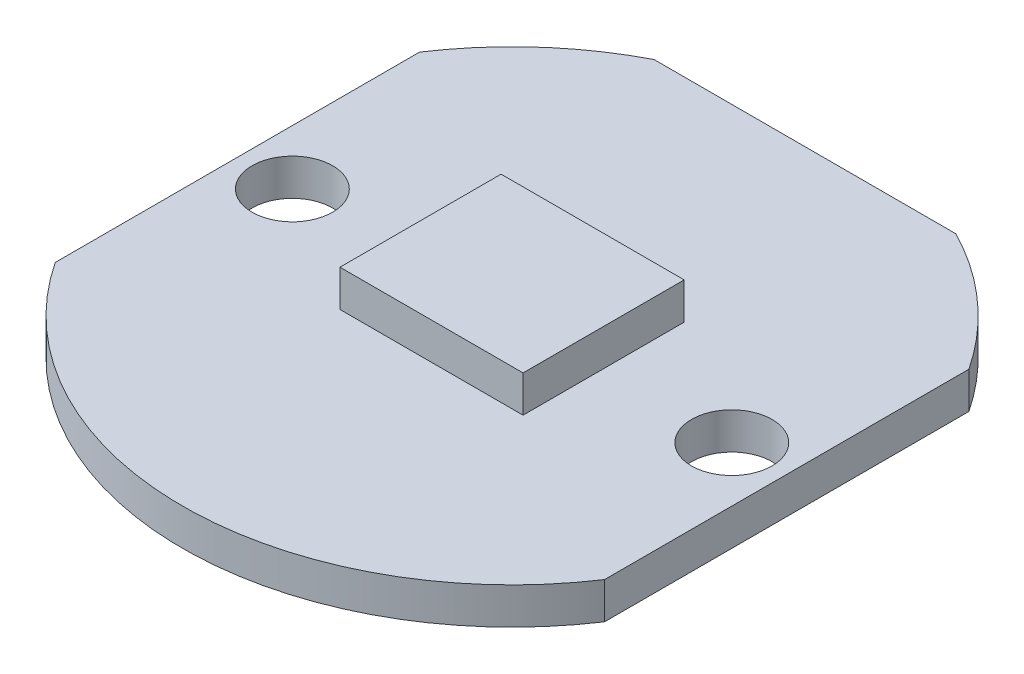
ISO-10303-21;
HEADER;
FILE_DESCRIPTION(('STEP AP214'),'2;1');
FILE_NAME('part.step','',(''),(''),'','','');
FILE_SCHEMA(('AUTOMOTIVE_DESIGN { 1 0 10303 214 1 1 1 1 }'));
ENDSEC;
DATA;
#1=APPLICATION_CONTEXT('core data for automotive mechanical design processes');
#2=APPLICATION_PROTOCOL_DEFINITION('international standard','automotive_design',2000,#1);
#3=PRODUCT_CONTEXT('',#1,'mechanical');
#4=PRODUCT('Part','Part','',(#3));
#5=PRODUCT_RELATED_PRODUCT_CATEGORY('part','',(#4));
#6=PRODUCT_DEFINITION_FORMATION('','',#4);
#7=PRODUCT_DEFINITION_CONTEXT('part definition',#1,'design');
#8=PRODUCT_DEFINITION('design','',#6,#7);
#9=PRODUCT_DEFINITION_SHAPE('','',#8);
#10=(LENGTH_UNIT() NAMED_UNIT(*) SI_UNIT(.MILLI.,.METRE.));
#11=(NAMED_UNIT(*) PLANE_ANGLE_UNIT() SI_UNIT($,.RADIAN.));
#12=(NAMED_UNIT(*) SI_UNIT($,.STERADIAN.) SOLID_ANGLE_UNIT());
#13=UNCERTAINTY_MEASURE_WITH_UNIT(LENGTH_MEASURE(1.E-05),#10,'distance_accuracy_value','');
#14=(GEOMETRIC_REPRESENTATION_CONTEXT(3) GLOBAL_UNCERTAINTY_ASSIGNED_CONTEXT((#13)) GLOBAL_UNIT_ASSIGNED_CONTEXT((#10,
#11,#12)) REPRESENTATION_CONTEXT('',''));
#15=CARTESIAN_POINT('',(0.,0.,0.));
#16=DIRECTION('',(0.,0.,1.));
#17=DIRECTION('',(1.,0.,0.));
#18=AXIS2_PLACEMENT_3D('',#15,#16,#17);
#19=CARTESIAN_POINT('',(-2.5,2.,2.2));
#20=DIRECTION('',(1.,0.,0.));
#21=DIRECTION('',(0.,0.,-1.));
#22=AXIS2_PLACEMENT_3D('',#19,#20,#21);
#23=PLANE('',#22);
#24=DIRECTION('',(0.,0.,1.));
#25=VECTOR('',#24,1.);
#26=CARTESIAN_POINT('',(-2.5,1.,2.2));
#27=LINE('',#26,#25);
#28=CARTESIAN_POINT('',(-2.5,1.,-2.2));
#29=VERTEX_POINT('',#28);
#30=CARTESIAN_POINT('',(-2.5,1.,2.2));
#31=VERTEX_POINT('',#30);
#32=EDGE_CURVE('E106',#29,#31,#27,.T.);
#33=ORIENTED_EDGE('',*,*,#32,.T.);
#34=DIRECTION('',(0.,-1.,0.));
#35=VECTOR('',#34,1.);
#36=CARTESIAN_POINT('',(-2.5,2.,2.2));
#37=LINE('',#36,#35);
#38=CARTESIAN_POINT('',(-2.5,2.,2.2));
#39=VERTEX_POINT('',#38);
#40=EDGE_CURVE('E12',#39,#31,#37,.T.);
#41=ORIENTED_EDGE('',*,*,#40,.F.);
#42=DIRECTION('',(0.,0.,1.));
#43=VECTOR('',#42,1.);
#44=CARTESIAN_POINT('',(-2.5,2.,2.2));
#45=LINE('',#44,#43);
#46=CARTESIAN_POINT('',(-2.5,2.,-2.2));
#47=VERTEX_POINT('',#46);
#48=EDGE_CURVE('E94',#47,#39,#45,.T.);
#49=ORIENTED_EDGE('',*,*,#48,.F.);
#50=DIRECTION('',(0.,-1.,0.));
#51=VECTOR('',#50,1.);
#52=CARTESIAN_POINT('',(-2.5,2.,-2.2));
#53=LINE('',#52,#51);
#54=EDGE_CURVE('E102',#47,#29,#53,.T.);
#55=ORIENTED_EDGE('',*,*,#54,.T.);
#56=EDGE_LOOP('',(#33,#41,#49,#55));
#57=FACE_BOUND('',#56,.T.);
#58=ADVANCED_FACE('F43',(#57),#23,.F.);
#59=CARTESIAN_POINT('',(2.5,2.,2.2));
#60=DIRECTION('',(0.,0.,-1.));
#61=DIRECTION('',(-1.,0.,0.));
#62=AXIS2_PLACEMENT_3D('',#59,#60,#61);
#63=PLANE('',#62);
#64=DIRECTION('',(1.,0.,0.));
#65=VECTOR('',#64,1.);
#66=CARTESIAN_POINT('',(2.5,1.,2.2));
#67=LINE('',#66,#65);
#68=CARTESIAN_POINT('',(2.5,1.,2.2));
#69=VERTEX_POINT('',#68);
#70=EDGE_CURVE('E98',#31,#69,#67,.T.);
#71=ORIENTED_EDGE('',*,*,#70,.T.);
#72=DIRECTION('',(0.,-1.,0.));
#73=VECTOR('',#72,1.);
#74=CARTESIAN_POINT('',(2.5,2.,2.2));
#75=LINE('',#74,#73);
#76=CARTESIAN_POINT('',(2.5,2.,2.2));
#77=VERTEX_POINT('',#76);
#78=EDGE_CURVE('E51',#77,#69,#75,.T.);
#79=ORIENTED_EDGE('',*,*,#78,.F.);
#80=DIRECTION('',(1.,0.,0.));
#81=VECTOR('',#80,1.);
#82=CARTESIAN_POINT('',(2.5,2.,2.2));
#83=LINE('',#82,#81);
#84=EDGE_CURVE('E89',#39,#77,#83,.T.);
#85=ORIENTED_EDGE('',*,*,#84,.F.);
#86=ORIENTED_EDGE('',*,*,#40,.T.);
#87=EDGE_LOOP('',(#71,#79,#85,#86));
#88=FACE_BOUND('',#87,.T.);
#89=ADVANCED_FACE('F97',(#88),#63,.F.);
#90=CARTESIAN_POINT('',(2.5,2.,2.2));
#91=DIRECTION('',(-1.,0.,0.));
#92=DIRECTION('',(0.,0.,1.));
#93=AXIS2_PLACEMENT_3D('',#90,#91,#92);
#94=PLANE('',#93);
#95=DIRECTION('',(0.,0.,-1.));
#96=VECTOR('',#95,1.);
#97=CARTESIAN_POINT('',(2.5,1.,2.2));
#98=LINE('',#97,#96);
#99=CARTESIAN_POINT('',(2.5,1.,-2.2));
#100=VERTEX_POINT('',#99);
#101=EDGE_CURVE('E76',#69,#100,#98,.T.);
#102=ORIENTED_EDGE('',*,*,#101,.T.);
#103=DIRECTION('',(0.,-1.,0.));
#104=VECTOR('',#103,1.);
#105=CARTESIAN_POINT('',(2.5,2.,-2.2));
#106=LINE('',#105,#104);
#107=CARTESIAN_POINT('',(2.5,2.,-2.2));
#108=VERTEX_POINT('',#107);
#109=EDGE_CURVE('E99',#108,#100,#106,.T.);
#110=ORIENTED_EDGE('',*,*,#109,.F.);
#111=DIRECTION('',(0.,0.,-1.));
#112=VECTOR('',#111,1.);
#113=CARTESIAN_POINT('',(2.5,2.,2.2));
#114=LINE('',#113,#112);
#115=EDGE_CURVE('E92',#77,#108,#114,.T.);
#116=ORIENTED_EDGE('',*,*,#115,.F.);
#117=ORIENTED_EDGE('',*,*,#78,.T.);
#118=EDGE_LOOP('',(#102,#110,#116,#117));
#119=FACE_BOUND('',#118,.T.);
#120=ADVANCED_FACE('F100',(#119),#94,.F.);
#121=CARTESIAN_POINT('',(2.5,2.,-2.2));
#122=DIRECTION('',(0.,0.,1.));
#123=DIRECTION('',(1.,0.,0.));
#124=AXIS2_PLACEMENT_3D('',#121,#122,#123);
#125=PLANE('',#124);
#126=DIRECTION('',(-1.,0.,0.));
#127=VECTOR('',#126,1.);
#128=CARTESIAN_POINT('',(2.5,1.,-2.2));
#129=LINE('',#128,#127);
#130=EDGE_CURVE('E82',#100,#29,#129,.T.);
#131=ORIENTED_EDGE('',*,*,#130,.T.);
#132=ORIENTED_EDGE('',*,*,#54,.F.);
#133=DIRECTION('',(-1.,0.,0.));
#134=VECTOR('',#133,1.);
#135=CARTESIAN_POINT('',(2.5,2.,-2.2));
#136=LINE('',#135,#134);
#137=EDGE_CURVE('E59',#108,#47,#136,.T.);
#138=ORIENTED_EDGE('',*,*,#137,.F.);
#139=ORIENTED_EDGE('',*,*,#109,.T.);
#140=EDGE_LOOP('',(#131,#132,#138,#139));
#141=FACE_BOUND('',#140,.T.);
#142=ADVANCED_FACE('F113',(#141),#125,.F.);
#143=CARTESIAN_POINT('',(0.,2.,0.));
#144=DIRECTION('',(0.,1.,0.));
#145=DIRECTION('',(0.,0.,1.));
#146=AXIS2_PLACEMENT_3D('',#143,#144,#145);
#147=PLANE('',#146);
#148=ORIENTED_EDGE('',*,*,#48,.T.);
#149=ORIENTED_EDGE('',*,*,#84,.T.);
#150=ORIENTED_EDGE('',*,*,#115,.T.);
#151=ORIENTED_EDGE('',*,*,#137,.T.);
#152=EDGE_LOOP('',(#148,#149,#150,#151));
#153=FACE_BOUND('',#152,.T.);
#154=ADVANCED_FACE('F90',(#153),#147,.T.);
#155=CARTESIAN_POINT('',(0.,1.,0.));
#156=DIRECTION('',(0.,1.,0.));
#157=DIRECTION('',(0.,0.,1.));
#158=AXIS2_PLACEMENT_3D('',#155,#156,#157);
#159=PLANE('',#158);
#160=ORIENTED_EDGE('',*,*,#32,.F.);
#161=ORIENTED_EDGE('',*,*,#130,.F.);
#162=ORIENTED_EDGE('',*,*,#101,.F.);
#163=ORIENTED_EDGE('',*,*,#70,.F.);
#164=EDGE_LOOP('',(#160,#161,#162,#163));
#165=FACE_BOUND('',#164,.T.);
#166=ADVANCED_FACE('F116',(#165),#159,.F.);
#167=CLOSED_SHELL('',(#58,#89,#120,#142,#154,#166));
#168=MANIFOLD_SOLID_BREP('B2',#167);
#169=CARTESIAN_POINT('',(7.5,1.,0.));
#170=DIRECTION('',(1.,0.,0.));
#171=DIRECTION('',(0.,0.,-1.));
#172=AXIS2_PLACEMENT_3D('',#169,#170,#171);
#173=PLANE('',#172);
#174=DIRECTION('',(0.,0.,1.));
#175=VECTOR('',#174,1.);
#176=CARTESIAN_POINT('',(7.5,0.,0.));
#177=LINE('',#176,#175);
#178=CARTESIAN_POINT('',(7.5,0.,-4.9749371855331));
#179=VERTEX_POINT('',#178);
#180=CARTESIAN_POINT('',(7.5,0.,4.9749371855331));
#181=VERTEX_POINT('',#180);
#182=EDGE_CURVE('E263',#179,#181,#177,.T.);
#183=ORIENTED_EDGE('',*,*,#182,.F.);
#184=DIRECTION('',(0.,-1.,0.));
#185=VECTOR('',#184,1.);
#186=CARTESIAN_POINT('',(7.5,1.,-4.9749371855331));
#187=LINE('',#186,#185);
#188=CARTESIAN_POINT('',(7.5,1.,-4.9749371855331));
#189=VERTEX_POINT('',#188);
#190=EDGE_CURVE('E41',#189,#179,#187,.T.);
#191=ORIENTED_EDGE('',*,*,#190,.F.);
#192=DIRECTION('',(0.,0.,1.));
#193=VECTOR('',#192,1.);
#194=CARTESIAN_POINT('',(7.5,1.,0.));
#195=LINE('',#194,#193);
#196=CARTESIAN_POINT('',(7.5,1.,4.9749371855331));
#197=VERTEX_POINT('',#196);
#198=EDGE_CURVE('E272',#189,#197,#195,.T.);
#199=ORIENTED_EDGE('',*,*,#198,.T.);
#200=DIRECTION('',(0.,-1.,0.));
#201=VECTOR('',#200,1.);
#202=CARTESIAN_POINT('',(7.5,1.,4.9749371855331));
#203=LINE('',#202,#201);
#204=EDGE_CURVE('E212',#197,#181,#203,.T.);
#205=ORIENTED_EDGE('',*,*,#204,.T.);
#206=EDGE_LOOP('',(#183,#191,#199,#205));
#207=FACE_BOUND('',#206,.T.);
#208=ADVANCED_FACE('F167',(#207),#173,.T.);
#209=CARTESIAN_POINT('',(0.,1.,0.));
#210=DIRECTION('',(0.,-1.,0.));
#211=DIRECTION('',(0.,0.,-1.));
#212=AXIS2_PLACEMENT_3D('',#209,#210,#211);
#213=CYLINDRICAL_SURFACE('',#212,9.);
#214=CARTESIAN_POINT('',(0.,0.,0.));
#215=DIRECTION('',(0.,1.,0.));
#216=DIRECTION('',(0.,0.,1.));
#217=AXIS2_PLACEMENT_3D('',#214,#215,#216);
#218=CIRCLE('',#217,9.);
#219=CARTESIAN_POINT('',(4.12310562561766,0.,-8.));
#220=VERTEX_POINT('',#219);
#221=EDGE_CURVE('E261',#179,#220,#218,.T.);
#222=ORIENTED_EDGE('',*,*,#221,.T.);
#223=DIRECTION('',(0.,-1.,0.));
#224=VECTOR('',#223,1.);
#225=CARTESIAN_POINT('',(4.12310562561766,1.,-8.));
#226=LINE('',#225,#224);
#227=CARTESIAN_POINT('',(4.12310562561766,1.,-8.));
#228=VERTEX_POINT('',#227);
#229=EDGE_CURVE('E176',#228,#220,#226,.T.);
#230=ORIENTED_EDGE('',*,*,#229,.F.);
#231=CARTESIAN_POINT('',(0.,1.,0.));
#232=DIRECTION('',(0.,1.,0.));
#233=DIRECTION('',(0.,0.,1.));
#234=AXIS2_PLACEMENT_3D('',#231,#232,#233);
#235=CIRCLE('',#234,9.);
#236=EDGE_CURVE('E243',#189,#228,#235,.T.);
#237=ORIENTED_EDGE('',*,*,#236,.F.);
#238=ORIENTED_EDGE('',*,*,#190,.T.);
#239=EDGE_LOOP('',(#222,#230,#237,#238));
#240=FACE_BOUND('',#239,.T.);
#241=ADVANCED_FACE('F262',(#240),#213,.T.);
#242=CARTESIAN_POINT('',(0.,1.,-8.));
#243=DIRECTION('',(0.,0.,-1.));
#244=DIRECTION('',(-1.,0.,0.));
#245=AXIS2_PLACEMENT_3D('',#242,#243,#244);
#246=PLANE('',#245);
#247=DIRECTION('',(1.,0.,0.));
#248=VECTOR('',#247,1.);
#249=CARTESIAN_POINT('',(0.,0.,-8.));
#250=LINE('',#249,#248);
#251=CARTESIAN_POINT('',(-4.12310562561766,0.,-8.));
#252=VERTEX_POINT('',#251);
#253=EDGE_CURVE('E258',#252,#220,#250,.T.);
#254=ORIENTED_EDGE('',*,*,#253,.F.);
#255=DIRECTION('',(0.,-1.,0.));
#256=VECTOR('',#255,1.);
#257=CARTESIAN_POINT('',(-4.12310562561766,1.,-8.));
#258=LINE('',#257,#256);
#259=CARTESIAN_POINT('',(-4.12310562561766,1.,-8.));
#260=VERTEX_POINT('',#259);
#261=EDGE_CURVE('E247',#260,#252,#258,.T.);
#262=ORIENTED_EDGE('',*,*,#261,.F.);
#263=DIRECTION('',(1.,0.,0.));
#264=VECTOR('',#263,1.);
#265=CARTESIAN_POINT('',(0.,1.,-8.));
#266=LINE('',#265,#264);
#267=EDGE_CURVE('E240',#260,#228,#266,.T.);
#268=ORIENTED_EDGE('',*,*,#267,.T.);
#269=ORIENTED_EDGE('',*,*,#229,.T.);
#270=EDGE_LOOP('',(#254,#262,#268,#269));
#271=FACE_BOUND('',#270,.T.);
#272=ADVANCED_FACE('F256',(#271),#246,.T.);
#273=CARTESIAN_POINT('',(-7.5,0.,-4.9749371855331));
#274=VERTEX_POINT('',#273);
#275=EDGE_CURVE('E246',#252,#274,#218,.T.);
#276=ORIENTED_EDGE('',*,*,#275,.T.);
#277=DIRECTION('',(0.,-1.,0.));
#278=VECTOR('',#277,1.);
#279=CARTESIAN_POINT('',(-7.5,1.,-4.9749371855331));
#280=LINE('',#279,#278);
#281=CARTESIAN_POINT('',(-7.5,1.,-4.9749371855331));
#282=VERTEX_POINT('',#281);
#283=EDGE_CURVE('E231',#282,#274,#280,.T.);
#284=ORIENTED_EDGE('',*,*,#283,.F.);
#285=EDGE_CURVE('E234',#260,#282,#235,.T.);
#286=ORIENTED_EDGE('',*,*,#285,.F.);
#287=ORIENTED_EDGE('',*,*,#261,.T.);
#288=EDGE_LOOP('',(#276,#284,#286,#287));
#289=FACE_BOUND('',#288,.T.);
#290=ADVANCED_FACE('F244',(#289),#213,.T.);
#291=CARTESIAN_POINT('',(-7.5,1.,0.));
#292=DIRECTION('',(1.,0.,0.));
#293=DIRECTION('',(0.,0.,-1.));
#294=AXIS2_PLACEMENT_3D('',#291,#292,#293);
#295=PLANE('',#294);
#296=DIRECTION('',(0.,0.,1.));
#297=VECTOR('',#296,1.);
#298=CARTESIAN_POINT('',(-7.5,0.,0.));
#299=LINE('',#298,#297);
#300=CARTESIAN_POINT('',(-7.5,0.,4.9749371855331));
#301=VERTEX_POINT('',#300);
#302=EDGE_CURVE('E267',#274,#301,#299,.T.);
#303=ORIENTED_EDGE('',*,*,#302,.T.);
#304=DIRECTION('',(0.,-1.,0.));
#305=VECTOR('',#304,1.);
#306=CARTESIAN_POINT('',(-7.5,1.,4.9749371855331));
#307=LINE('',#306,#305);
#308=CARTESIAN_POINT('',(-7.5,1.,4.9749371855331));
#309=VERTEX_POINT('',#308);
#310=EDGE_CURVE('E233',#309,#301,#307,.T.);
#311=ORIENTED_EDGE('',*,*,#310,.F.);
#312=DIRECTION('',(0.,0.,1.));
#313=VECTOR('',#312,1.);
#314=CARTESIAN_POINT('',(-7.5,1.,0.));
#315=LINE('',#314,#313);
#316=EDGE_CURVE('E226',#282,#309,#315,.T.);
#317=ORIENTED_EDGE('',*,*,#316,.F.);
#318=ORIENTED_EDGE('',*,*,#283,.T.);
#319=EDGE_LOOP('',(#303,#311,#317,#318));
#320=FACE_BOUND('',#319,.T.);
#321=ADVANCED_FACE('F229',(#320),#295,.F.);
#322=CARTESIAN_POINT('',(-6.,1.,0.));
#323=DIRECTION('',(0.,-1.,0.));
#324=DIRECTION('',(0.,0.,-1.));
#325=AXIS2_PLACEMENT_3D('',#322,#323,#324);
#326=CYLINDRICAL_SURFACE('',#325,1.1);
#327=CARTESIAN_POINT('',(-6.,1.,0.));
#328=DIRECTION('',(0.,1.,0.));
#329=DIRECTION('',(0.,0.,1.));
#330=AXIS2_PLACEMENT_3D('',#327,#328,#329);
#331=CIRCLE('',#330,1.1);
#332=CARTESIAN_POINT('',(-6.,1.,1.1));
#333=VERTEX_POINT('',#332);
#334=EDGE_CURVE('E273',#333,#333,#331,.T.);
#335=ORIENTED_EDGE('',*,*,#334,.T.);
#336=EDGE_LOOP('',(#335));
#337=FACE_BOUND('',#336,.T.);
#338=CARTESIAN_POINT('',(-6.,0.,0.));
#339=DIRECTION('',(0.,1.,0.));
#340=DIRECTION('',(0.,0.,1.));
#341=AXIS2_PLACEMENT_3D('',#338,#339,#340);
#342=CIRCLE('',#341,1.1);
#343=CARTESIAN_POINT('',(-6.,0.,1.1));
#344=VERTEX_POINT('',#343);
#345=EDGE_CURVE('E283',#344,#344,#342,.T.);
#346=ORIENTED_EDGE('',*,*,#345,.F.);
#347=EDGE_LOOP('',(#346));
#348=FACE_BOUND('',#347,.T.);
#349=ADVANCED_FACE('F294',(#337,#348),#326,.F.);
#350=CARTESIAN_POINT('',(6.,1.,0.));
#351=DIRECTION('',(0.,-1.,0.));
#352=DIRECTION('',(0.,0.,-1.));
#353=AXIS2_PLACEMENT_3D('',#350,#351,#352);
#354=CYLINDRICAL_SURFACE('',#353,1.1);
#355=CARTESIAN_POINT('',(6.,1.,0.));
#356=DIRECTION('',(0.,1.,0.));
#357=DIRECTION('',(0.,0.,1.));
#358=AXIS2_PLACEMENT_3D('',#355,#356,#357);
#359=CIRCLE('',#358,1.1);
#360=CARTESIAN_POINT('',(6.,1.,1.1));
#361=VERTEX_POINT('',#360);
#362=EDGE_CURVE('E275',#361,#361,#359,.T.);
#363=ORIENTED_EDGE('',*,*,#362,.T.);
#364=EDGE_LOOP('',(#363));
#365=FACE_BOUND('',#364,.T.);
#366=CARTESIAN_POINT('',(6.,0.,0.));
#367=DIRECTION('',(0.,1.,0.));
#368=DIRECTION('',(0.,0.,1.));
#369=AXIS2_PLACEMENT_3D('',#366,#367,#368);
#370=CIRCLE('',#369,1.1);
#371=CARTESIAN_POINT('',(6.,0.,1.1));
#372=VERTEX_POINT('',#371);
#373=EDGE_CURVE('E285',#372,#372,#370,.T.);
#374=ORIENTED_EDGE('',*,*,#373,.F.);
#375=EDGE_LOOP('',(#374));
#376=FACE_BOUND('',#375,.T.);
#377=ADVANCED_FACE('F169',(#365,#376),#354,.F.);
#378=EDGE_CURVE('E205',#301,#181,#218,.T.);
#379=ORIENTED_EDGE('',*,*,#378,.T.);
#380=ORIENTED_EDGE('',*,*,#204,.F.);
#381=EDGE_CURVE('E184',#309,#197,#235,.T.);
#382=ORIENTED_EDGE('',*,*,#381,.F.);
#383=ORIENTED_EDGE('',*,*,#310,.T.);
#384=EDGE_LOOP('',(#379,#380,#382,#383));
#385=FACE_BOUND('',#384,.T.);
#386=ADVANCED_FACE('F282',(#385),#213,.T.);
#387=CARTESIAN_POINT('',(0.,1.,0.));
#388=DIRECTION('',(0.,1.,0.));
#389=DIRECTION('',(0.,0.,1.));
#390=AXIS2_PLACEMENT_3D('',#387,#388,#389);
#391=PLANE('',#390);
#392=ORIENTED_EDGE('',*,*,#362,.F.);
#393=EDGE_LOOP('',(#392));
#394=FACE_BOUND('',#393,.T.);
#395=ORIENTED_EDGE('',*,*,#334,.F.);
#396=EDGE_LOOP('',(#395));
#397=FACE_BOUND('',#396,.T.);
#398=ORIENTED_EDGE('',*,*,#198,.F.);
#399=ORIENTED_EDGE('',*,*,#236,.T.);
#400=ORIENTED_EDGE('',*,*,#267,.F.);
#401=ORIENTED_EDGE('',*,*,#285,.T.);
#402=ORIENTED_EDGE('',*,*,#316,.T.);
#403=ORIENTED_EDGE('',*,*,#381,.T.);
#404=EDGE_LOOP('',(#398,#399,#400,#401,#402,#403));
#405=FACE_BOUND('',#404,.T.);
#406=ADVANCED_FACE('F238',(#394,#397,#405),#391,.T.);
#407=CARTESIAN_POINT('',(0.,0.,0.));
#408=DIRECTION('',(0.,1.,0.));
#409=DIRECTION('',(0.,0.,1.));
#410=AXIS2_PLACEMENT_3D('',#407,#408,#409);
#411=PLANE('',#410);
#412=ORIENTED_EDGE('',*,*,#373,.T.);
#413=EDGE_LOOP('',(#412));
#414=FACE_BOUND('',#413,.T.);
#415=ORIENTED_EDGE('',*,*,#345,.T.);
#416=EDGE_LOOP('',(#415));
#417=FACE_BOUND('',#416,.T.);
#418=ORIENTED_EDGE('',*,*,#182,.T.);
#419=ORIENTED_EDGE('',*,*,#378,.F.);
#420=ORIENTED_EDGE('',*,*,#302,.F.);
#421=ORIENTED_EDGE('',*,*,#275,.F.);
#422=ORIENTED_EDGE('',*,*,#253,.T.);
#423=ORIENTED_EDGE('',*,*,#221,.F.);
#424=EDGE_LOOP('',(#418,#419,#420,#421,#422,#423));
#425=FACE_BOUND('',#424,.T.);
#426=ADVANCED_FACE('F265',(#414,#417,#425),#411,.F.);
#427=CLOSED_SHELL('',(#208,#241,#272,#290,#321,#349,#377,#386,#406,#426));
#428=MANIFOLD_SOLID_BREP('B6',#427);
#429=ADVANCED_BREP_SHAPE_REPRESENTATION('',(#18,#168,#428),#14);
#430=SHAPE_DEFINITION_REPRESENTATION(#9,#429);
ENDSEC;
END-ISO-10303-21;
